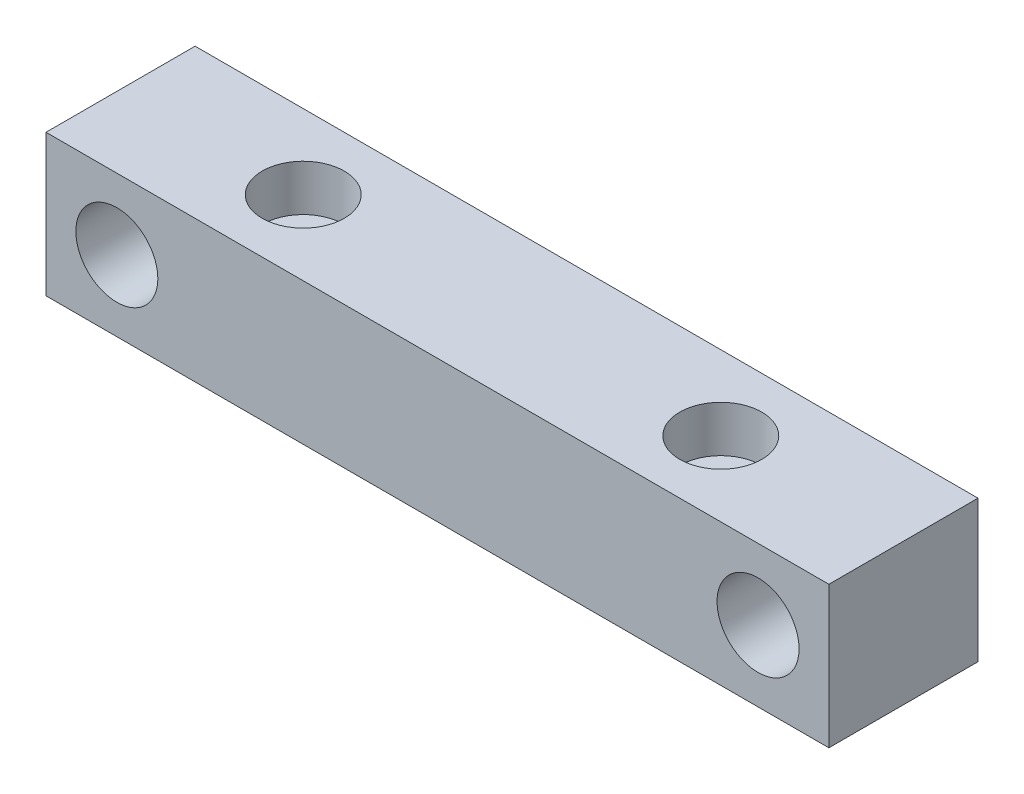
ISO-10303-21;
HEADER;
FILE_DESCRIPTION(('STEP AP214'),'2;1');
FILE_NAME('part.step','',(''),(''),'','','');
FILE_SCHEMA(('AUTOMOTIVE_DESIGN { 1 0 10303 214 1 1 1 1 }'));
ENDSEC;
DATA;
#1=APPLICATION_CONTEXT('core data for automotive mechanical design processes');
#2=APPLICATION_PROTOCOL_DEFINITION('international standard','automotive_design',2000,#1);
#3=PRODUCT_CONTEXT('',#1,'mechanical');
#4=PRODUCT('Part','Part','',(#3));
#5=PRODUCT_RELATED_PRODUCT_CATEGORY('part','',(#4));
#6=PRODUCT_DEFINITION_FORMATION('','',#4);
#7=PRODUCT_DEFINITION_CONTEXT('part definition',#1,'design');
#8=PRODUCT_DEFINITION('design','',#6,#7);
#9=PRODUCT_DEFINITION_SHAPE('','',#8);
#10=(LENGTH_UNIT() NAMED_UNIT(*) SI_UNIT(.MILLI.,.METRE.));
#11=(NAMED_UNIT(*) PLANE_ANGLE_UNIT() SI_UNIT($,.RADIAN.));
#12=(NAMED_UNIT(*) SI_UNIT($,.STERADIAN.) SOLID_ANGLE_UNIT());
#13=UNCERTAINTY_MEASURE_WITH_UNIT(LENGTH_MEASURE(1.E-05),#10,'distance_accuracy_value','');
#14=(GEOMETRIC_REPRESENTATION_CONTEXT(3) GLOBAL_UNCERTAINTY_ASSIGNED_CONTEXT((#13)) GLOBAL_UNIT_ASSIGNED_CONTEXT((#10,
#11,#12)) REPRESENTATION_CONTEXT('',''));
#15=CARTESIAN_POINT('',(0.,0.,0.));
#16=DIRECTION('',(0.,0.,1.));
#17=DIRECTION('',(1.,0.,0.));
#18=AXIS2_PLACEMENT_3D('',#15,#16,#17);
#19=CARTESIAN_POINT('',(-10.7499999999994,-11.4997460961056,5.));
#20=DIRECTION('',(0.,1.,0.));
#21=DIRECTION('',(0.,0.,1.));
#22=AXIS2_PLACEMENT_3D('',#19,#20,#21);
#23=CYLINDRICAL_SURFACE('',#22,1.375);
#24=CARTESIAN_POINT('',(-10.7499999999994,-11.4987460961056,5.));
#25=DIRECTION('',(0.,1.,0.));
#26=DIRECTION('',(0.,0.,1.));
#27=AXIS2_PLACEMENT_3D('',#24,#25,#26);
#28=CIRCLE('',#27,1.375);
#29=CARTESIAN_POINT('',(-10.7499999999994,-11.4987460961056,6.375));
#30=VERTEX_POINT('',#29);
#31=EDGE_CURVE('E126',#30,#30,#28,.F.);
#32=ORIENTED_EDGE('',*,*,#31,.T.);
#33=EDGE_LOOP('',(#32));
#34=FACE_BOUND('',#33,.T.);
#35=CARTESIAN_POINT('',(-10.7499999999994,-5.098746096105,5.));
#36=DIRECTION('',(0.,1.,0.));
#37=DIRECTION('',(0.,0.,1.));
#38=AXIS2_PLACEMENT_3D('',#35,#36,#37);
#39=CIRCLE('',#38,1.375);
#40=CARTESIAN_POINT('',(-10.7499999999994,-5.098746096105,6.375));
#41=VERTEX_POINT('',#40);
#42=EDGE_CURVE('E119',#41,#41,#39,.F.);
#43=ORIENTED_EDGE('',*,*,#42,.F.);
#44=EDGE_LOOP('',(#43));
#45=FACE_BOUND('',#44,.T.);
#46=ADVANCED_FACE('F34',(#34,#45),#23,.F.);
#47=CARTESIAN_POINT('',(0.,0.,10.));
#48=DIRECTION('',(0.,0.,1.));
#49=DIRECTION('',(1.,0.,0.));
#50=AXIS2_PLACEMENT_3D('',#47,#48,#49);
#51=PLANE('',#50);
#52=CARTESIAN_POINT('',(-3.24999999999941,-6.74874609610532,10.));
#53=DIRECTION('',(0.,0.,1.));
#54=DIRECTION('',(1.,0.,0.));
#55=AXIS2_PLACEMENT_3D('',#52,#53,#54);
#56=CIRCLE('',#55,2.75000000000001);
#57=CARTESIAN_POINT('',(-0.499999999999405,-6.74874609610532,10.));
#58=VERTEX_POINT('',#57);
#59=EDGE_CURVE('E141',#58,#58,#56,.T.);
#60=ORIENTED_EDGE('',*,*,#59,.F.);
#61=EDGE_LOOP('',(#60));
#62=FACE_BOUND('',#61,.T.);
#63=CARTESIAN_POINT('',(-46.2500000000005,-6.74874609610562,10.));
#64=DIRECTION('',(0.,0.,1.));
#65=DIRECTION('',(1.,0.,0.));
#66=AXIS2_PLACEMENT_3D('',#63,#64,#65);
#67=CIRCLE('',#66,2.75);
#68=CARTESIAN_POINT('',(-43.5000000000005,-6.74874609610562,10.));
#69=VERTEX_POINT('',#68);
#70=EDGE_CURVE('E117',#69,#69,#67,.T.);
#71=ORIENTED_EDGE('',*,*,#70,.F.);
#72=EDGE_LOOP('',(#71));
#73=FACE_BOUND('',#72,.T.);
#74=DIRECTION('',(0.,-1.,0.));
#75=VECTOR('',#74,1.);
#76=CARTESIAN_POINT('',(-51.0000000000009,-1.99874609610499,10.));
#77=LINE('',#76,#75);
#78=CARTESIAN_POINT('',(-51.0000000000009,-1.99874609610499,10.));
#79=VERTEX_POINT('',#78);
#80=CARTESIAN_POINT('',(-51.0000000000009,-11.4987460961056,10.));
#81=VERTEX_POINT('',#80);
#82=EDGE_CURVE('E88',#79,#81,#77,.T.);
#83=ORIENTED_EDGE('',*,*,#82,.T.);
#84=DIRECTION('',(1.,0.,0.));
#85=VECTOR('',#84,1.);
#86=CARTESIAN_POINT('',(-51.0000000000009,-11.4987460961056,10.));
#87=LINE('',#86,#85);
#88=CARTESIAN_POINT('',(1.50000000000021,-11.4987460961056,10.));
#89=VERTEX_POINT('',#88);
#90=EDGE_CURVE('E83',#81,#89,#87,.T.);
#91=ORIENTED_EDGE('',*,*,#90,.T.);
#92=DIRECTION('',(0.,1.,0.));
#93=VECTOR('',#92,1.);
#94=CARTESIAN_POINT('',(1.50000000000021,-1.99874609610499,10.));
#95=LINE('',#94,#93);
#96=CARTESIAN_POINT('',(1.50000000000021,-1.99874609610499,10.));
#97=VERTEX_POINT('',#96);
#98=EDGE_CURVE('E86',#89,#97,#95,.T.);
#99=ORIENTED_EDGE('',*,*,#98,.T.);
#100=DIRECTION('',(-1.,0.,0.));
#101=VECTOR('',#100,1.);
#102=CARTESIAN_POINT('',(-51.0000000000009,-1.99874609610499,10.));
#103=LINE('',#102,#101);
#104=EDGE_CURVE('E53',#97,#79,#103,.T.);
#105=ORIENTED_EDGE('',*,*,#104,.T.);
#106=EDGE_LOOP('',(#83,#91,#99,#105));
#107=FACE_BOUND('',#106,.T.);
#108=ADVANCED_FACE('F84',(#62,#73,#107),#51,.T.);
#109=CARTESIAN_POINT('',(0.,0.,0.));
#110=DIRECTION('',(0.,0.,1.));
#111=DIRECTION('',(1.,0.,0.));
#112=AXIS2_PLACEMENT_3D('',#109,#110,#111);
#113=PLANE('',#112);
#114=DIRECTION('',(0.,-1.,0.));
#115=VECTOR('',#114,1.);
#116=CARTESIAN_POINT('',(-51.0000000000009,-1.99874609610499,0.));
#117=LINE('',#116,#115);
#118=CARTESIAN_POINT('',(-51.0000000000009,-1.99874609610499,0.));
#119=VERTEX_POINT('',#118);
#120=CARTESIAN_POINT('',(-51.0000000000009,-11.4987460961056,0.));
#121=VERTEX_POINT('',#120);
#122=EDGE_CURVE('E101',#119,#121,#117,.T.);
#123=ORIENTED_EDGE('',*,*,#122,.F.);
#124=DIRECTION('',(-1.,0.,0.));
#125=VECTOR('',#124,1.);
#126=CARTESIAN_POINT('',(-51.0000000000009,-1.99874609610499,0.));
#127=LINE('',#126,#125);
#128=CARTESIAN_POINT('',(1.50000000000021,-1.99874609610499,0.));
#129=VERTEX_POINT('',#128);
#130=EDGE_CURVE('E76',#129,#119,#127,.T.);
#131=ORIENTED_EDGE('',*,*,#130,.F.);
#132=DIRECTION('',(0.,1.,0.));
#133=VECTOR('',#132,1.);
#134=CARTESIAN_POINT('',(1.50000000000021,-1.99874609610499,0.));
#135=LINE('',#134,#133);
#136=CARTESIAN_POINT('',(1.50000000000021,-11.4987460961056,0.));
#137=VERTEX_POINT('',#136);
#138=EDGE_CURVE('E70',#137,#129,#135,.T.);
#139=ORIENTED_EDGE('',*,*,#138,.F.);
#140=DIRECTION('',(1.,0.,0.));
#141=VECTOR('',#140,1.);
#142=CARTESIAN_POINT('',(-51.0000000000009,-11.4987460961056,0.));
#143=LINE('',#142,#141);
#144=EDGE_CURVE('E92',#121,#137,#143,.T.);
#145=ORIENTED_EDGE('',*,*,#144,.F.);
#146=EDGE_LOOP('',(#123,#131,#139,#145));
#147=FACE_BOUND('',#146,.T.);
#148=CARTESIAN_POINT('',(-46.2500000000005,-6.74874609610562,0.));
#149=DIRECTION('',(0.,0.,1.));
#150=DIRECTION('',(1.,0.,0.));
#151=AXIS2_PLACEMENT_3D('',#148,#149,#150);
#152=CIRCLE('',#151,1.375);
#153=CARTESIAN_POINT('',(-44.8750000000005,-6.74874609610562,0.));
#154=VERTEX_POINT('',#153);
#155=EDGE_CURVE('E104',#154,#154,#152,.T.);
#156=ORIENTED_EDGE('',*,*,#155,.T.);
#157=EDGE_LOOP('',(#156));
#158=FACE_BOUND('',#157,.T.);
#159=CARTESIAN_POINT('',(-3.24999999999941,-6.74874609610532,0.));
#160=DIRECTION('',(0.,0.,1.));
#161=DIRECTION('',(1.,0.,0.));
#162=AXIS2_PLACEMENT_3D('',#159,#160,#161);
#163=CIRCLE('',#162,1.375);
#164=CARTESIAN_POINT('',(-1.87499999999941,-6.74874609610532,0.));
#165=VERTEX_POINT('',#164);
#166=EDGE_CURVE('E113',#165,#165,#163,.T.);
#167=ORIENTED_EDGE('',*,*,#166,.T.);
#168=EDGE_LOOP('',(#167));
#169=FACE_BOUND('',#168,.T.);
#170=ADVANCED_FACE('F155',(#147,#158,#169),#113,.F.);
#171=CARTESIAN_POINT('',(-51.0000000000009,-1.99874609610499,10.));
#172=DIRECTION('',(1.,0.,0.));
#173=DIRECTION('',(0.,0.,-1.));
#174=AXIS2_PLACEMENT_3D('',#171,#172,#173);
#175=PLANE('',#174);
#176=ORIENTED_EDGE('',*,*,#122,.T.);
#177=DIRECTION('',(0.,0.,-1.));
#178=VECTOR('',#177,1.);
#179=CARTESIAN_POINT('',(-51.0000000000009,-11.4987460961056,10.));
#180=LINE('',#179,#178);
#181=EDGE_CURVE('E12',#81,#121,#180,.T.);
#182=ORIENTED_EDGE('',*,*,#181,.F.);
#183=ORIENTED_EDGE('',*,*,#82,.F.);
#184=DIRECTION('',(0.,0.,-1.));
#185=VECTOR('',#184,1.);
#186=CARTESIAN_POINT('',(-51.0000000000009,-1.99874609610499,10.));
#187=LINE('',#186,#185);
#188=EDGE_CURVE('E97',#79,#119,#187,.T.);
#189=ORIENTED_EDGE('',*,*,#188,.T.);
#190=EDGE_LOOP('',(#176,#182,#183,#189));
#191=FACE_BOUND('',#190,.T.);
#192=ADVANCED_FACE('F36',(#191),#175,.F.);
#193=CARTESIAN_POINT('',(-51.0000000000009,-11.4987460961056,10.));
#194=DIRECTION('',(0.,1.,0.));
#195=DIRECTION('',(0.,0.,1.));
#196=AXIS2_PLACEMENT_3D('',#193,#194,#195);
#197=PLANE('',#196);
#198=CARTESIAN_POINT('',(-38.7500000000013,-11.4987460961056,5.));
#199=DIRECTION('',(0.,1.,0.));
#200=DIRECTION('',(0.,0.,1.));
#201=AXIS2_PLACEMENT_3D('',#198,#199,#200);
#202=CIRCLE('',#201,1.375);
#203=CARTESIAN_POINT('',(-38.7500000000013,-11.4987460961056,6.375));
#204=VERTEX_POINT('',#203);
#205=EDGE_CURVE('E121',#204,#204,#202,.F.);
#206=ORIENTED_EDGE('',*,*,#205,.F.);
#207=EDGE_LOOP('',(#206));
#208=FACE_BOUND('',#207,.T.);
#209=ORIENTED_EDGE('',*,*,#31,.F.);
#210=EDGE_LOOP('',(#209));
#211=FACE_BOUND('',#210,.T.);
#212=ORIENTED_EDGE('',*,*,#144,.T.);
#213=DIRECTION('',(0.,0.,-1.));
#214=VECTOR('',#213,1.);
#215=CARTESIAN_POINT('',(1.50000000000021,-11.4987460961056,10.));
#216=LINE('',#215,#214);
#217=EDGE_CURVE('E44',#89,#137,#216,.T.);
#218=ORIENTED_EDGE('',*,*,#217,.F.);
#219=ORIENTED_EDGE('',*,*,#90,.F.);
#220=ORIENTED_EDGE('',*,*,#181,.T.);
#221=EDGE_LOOP('',(#212,#218,#219,#220));
#222=FACE_BOUND('',#221,.T.);
#223=ADVANCED_FACE('F91',(#208,#211,#222),#197,.F.);
#224=CARTESIAN_POINT('',(1.50000000000021,-1.99874609610499,10.));
#225=DIRECTION('',(-1.,0.,0.));
#226=DIRECTION('',(0.,0.,1.));
#227=AXIS2_PLACEMENT_3D('',#224,#225,#226);
#228=PLANE('',#227);
#229=ORIENTED_EDGE('',*,*,#138,.T.);
#230=DIRECTION('',(0.,0.,-1.));
#231=VECTOR('',#230,1.);
#232=CARTESIAN_POINT('',(1.50000000000021,-1.99874609610499,10.));
#233=LINE('',#232,#231);
#234=EDGE_CURVE('E93',#97,#129,#233,.T.);
#235=ORIENTED_EDGE('',*,*,#234,.F.);
#236=ORIENTED_EDGE('',*,*,#98,.F.);
#237=ORIENTED_EDGE('',*,*,#217,.T.);
#238=EDGE_LOOP('',(#229,#235,#236,#237));
#239=FACE_BOUND('',#238,.T.);
#240=ADVANCED_FACE('F95',(#239),#228,.F.);
#241=CARTESIAN_POINT('',(-51.0000000000009,-1.99874609610499,10.));
#242=DIRECTION('',(0.,-1.,0.));
#243=DIRECTION('',(0.,0.,-1.));
#244=AXIS2_PLACEMENT_3D('',#241,#242,#243);
#245=PLANE('',#244);
#246=CARTESIAN_POINT('',(-38.7500000000013,-1.99874609610499,5.));
#247=DIRECTION('',(0.,1.,0.));
#248=DIRECTION('',(0.,0.,-1.));
#249=AXIS2_PLACEMENT_3D('',#246,#247,#248);
#250=CIRCLE('',#249,2.75);
#251=CARTESIAN_POINT('',(-38.7500000000013,-1.99874609610499,7.75));
#252=VERTEX_POINT('',#251);
#253=EDGE_CURVE('E136',#252,#252,#250,.T.);
#254=ORIENTED_EDGE('',*,*,#253,.F.);
#255=EDGE_LOOP('',(#254));
#256=FACE_BOUND('',#255,.T.);
#257=CARTESIAN_POINT('',(-10.7499999999994,-1.99874609610499,5.));
#258=DIRECTION('',(0.,1.,0.));
#259=DIRECTION('',(0.,0.,1.));
#260=AXIS2_PLACEMENT_3D('',#257,#258,#259);
#261=CIRCLE('',#260,2.75);
#262=CARTESIAN_POINT('',(-10.7499999999994,-1.99874609610499,7.75));
#263=VERTEX_POINT('',#262);
#264=EDGE_CURVE('E129',#263,#263,#261,.T.);
#265=ORIENTED_EDGE('',*,*,#264,.F.);
#266=EDGE_LOOP('',(#265));
#267=FACE_BOUND('',#266,.T.);
#268=ORIENTED_EDGE('',*,*,#130,.T.);
#269=ORIENTED_EDGE('',*,*,#188,.F.);
#270=ORIENTED_EDGE('',*,*,#104,.F.);
#271=ORIENTED_EDGE('',*,*,#234,.T.);
#272=EDGE_LOOP('',(#268,#269,#270,#271));
#273=FACE_BOUND('',#272,.T.);
#274=ADVANCED_FACE('F161',(#256,#267,#273),#245,.F.);
#275=CARTESIAN_POINT('',(-46.2500000000005,-6.74874609610562,10.));
#276=DIRECTION('',(0.,0.,-1.));
#277=DIRECTION('',(-1.,0.,0.));
#278=AXIS2_PLACEMENT_3D('',#275,#276,#277);
#279=CYLINDRICAL_SURFACE('',#278,1.375);
#280=CARTESIAN_POINT('',(-46.2500000000005,-6.74874609610562,3.));
#281=DIRECTION('',(0.,0.,-1.));
#282=DIRECTION('',(-1.,0.,0.));
#283=AXIS2_PLACEMENT_3D('',#280,#281,#282);
#284=CIRCLE('',#283,1.375);
#285=CARTESIAN_POINT('',(-47.6250000000005,-6.74874609610562,3.));
#286=VERTEX_POINT('',#285);
#287=EDGE_CURVE('E110',#286,#286,#284,.T.);
#288=ORIENTED_EDGE('',*,*,#287,.F.);
#289=EDGE_LOOP('',(#288));
#290=FACE_BOUND('',#289,.T.);
#291=ORIENTED_EDGE('',*,*,#155,.F.);
#292=EDGE_LOOP('',(#291));
#293=FACE_BOUND('',#292,.T.);
#294=ADVANCED_FACE('F158',(#290,#293),#279,.F.);
#295=CARTESIAN_POINT('',(-3.24999999999941,-6.74874609610532,10.));
#296=DIRECTION('',(0.,0.,-1.));
#297=DIRECTION('',(-1.,0.,0.));
#298=AXIS2_PLACEMENT_3D('',#295,#296,#297);
#299=CYLINDRICAL_SURFACE('',#298,1.375);
#300=CARTESIAN_POINT('',(-3.24999999999941,-6.74874609610532,3.));
#301=DIRECTION('',(0.,0.,-1.));
#302=DIRECTION('',(-1.,0.,0.));
#303=AXIS2_PLACEMENT_3D('',#300,#301,#302);
#304=CIRCLE('',#303,1.375);
#305=CARTESIAN_POINT('',(-4.62499999999942,-6.74874609610532,3.));
#306=VERTEX_POINT('',#305);
#307=EDGE_CURVE('E115',#306,#306,#304,.T.);
#308=ORIENTED_EDGE('',*,*,#307,.F.);
#309=EDGE_LOOP('',(#308));
#310=FACE_BOUND('',#309,.T.);
#311=ORIENTED_EDGE('',*,*,#166,.F.);
#312=EDGE_LOOP('',(#311));
#313=FACE_BOUND('',#312,.T.);
#314=ADVANCED_FACE('F160',(#310,#313),#299,.F.);
#315=CARTESIAN_POINT('',(10.7499999999997,-17.1999999999999,3.));
#316=DIRECTION('',(0.,0.,-1.));
#317=DIRECTION('',(0.,1.,0.));
#318=AXIS2_PLACEMENT_3D('',#315,#316,#317);
#319=PLANE('',#318);
#320=ORIENTED_EDGE('',*,*,#287,.T.);
#321=EDGE_LOOP('',(#320));
#322=FACE_BOUND('',#321,.T.);
#323=CARTESIAN_POINT('',(-46.2500000000005,-6.74874609610562,3.));
#324=DIRECTION('',(0.,0.,-1.));
#325=DIRECTION('',(-1.,0.,0.));
#326=AXIS2_PLACEMENT_3D('',#323,#324,#325);
#327=CIRCLE('',#326,2.75);
#328=CARTESIAN_POINT('',(-49.0000000000005,-6.74874609610562,3.));
#329=VERTEX_POINT('',#328);
#330=EDGE_CURVE('E114',#329,#329,#327,.F.);
#331=ORIENTED_EDGE('',*,*,#330,.T.);
#332=EDGE_LOOP('',(#331));
#333=FACE_BOUND('',#332,.T.);
#334=ADVANCED_FACE('F168',(#322,#333),#319,.F.);
#335=CARTESIAN_POINT('',(-46.2500000000005,-6.74874609610562,-7.77817459305204));
#336=DIRECTION('',(0.,0.,1.));
#337=DIRECTION('',(1.,0.,0.));
#338=AXIS2_PLACEMENT_3D('',#335,#336,#337);
#339=CYLINDRICAL_SURFACE('',#338,2.75);
#340=ORIENTED_EDGE('',*,*,#70,.T.);
#341=EDGE_LOOP('',(#340));
#342=FACE_BOUND('',#341,.T.);
#343=ORIENTED_EDGE('',*,*,#330,.F.);
#344=EDGE_LOOP('',(#343));
#345=FACE_BOUND('',#344,.T.);
#346=ADVANCED_FACE('F194',(#342,#345),#339,.F.);
#347=CARTESIAN_POINT('',(10.7499999999997,-17.1999999999999,3.));
#348=DIRECTION('',(0.,0.,-1.));
#349=DIRECTION('',(0.,1.,0.));
#350=AXIS2_PLACEMENT_3D('',#347,#348,#349);
#351=PLANE('',#350);
#352=ORIENTED_EDGE('',*,*,#307,.T.);
#353=EDGE_LOOP('',(#352));
#354=FACE_BOUND('',#353,.T.);
#355=CARTESIAN_POINT('',(-3.24999999999941,-6.74874609610532,3.));
#356=DIRECTION('',(0.,0.,-1.));
#357=DIRECTION('',(-1.,0.,0.));
#358=AXIS2_PLACEMENT_3D('',#355,#356,#357);
#359=CIRCLE('',#358,2.75000000000001);
#360=CARTESIAN_POINT('',(-5.99999999999942,-6.74874609610532,3.));
#361=VERTEX_POINT('',#360);
#362=EDGE_CURVE('E118',#361,#361,#359,.F.);
#363=ORIENTED_EDGE('',*,*,#362,.T.);
#364=EDGE_LOOP('',(#363));
#365=FACE_BOUND('',#364,.T.);
#366=ADVANCED_FACE('F190',(#354,#365),#351,.F.);
#367=CARTESIAN_POINT('',(-3.24999999999941,-6.74874609610532,-7.77817459305204));
#368=DIRECTION('',(0.,0.,1.));
#369=DIRECTION('',(1.,0.,0.));
#370=AXIS2_PLACEMENT_3D('',#367,#368,#369);
#371=CYLINDRICAL_SURFACE('',#370,2.75000000000001);
#372=ORIENTED_EDGE('',*,*,#59,.T.);
#373=EDGE_LOOP('',(#372));
#374=FACE_BOUND('',#373,.T.);
#375=ORIENTED_EDGE('',*,*,#362,.F.);
#376=EDGE_LOOP('',(#375));
#377=FACE_BOUND('',#376,.T.);
#378=ADVANCED_FACE('F187',(#374,#377),#371,.F.);
#379=CARTESIAN_POINT('',(-38.7500000000013,-11.4997460961056,5.));
#380=DIRECTION('',(0.,1.,0.));
#381=DIRECTION('',(0.,0.,1.));
#382=AXIS2_PLACEMENT_3D('',#379,#380,#381);
#383=CYLINDRICAL_SURFACE('',#382,1.375);
#384=CARTESIAN_POINT('',(-38.7500000000013,-5.098746096105,5.));
#385=DIRECTION('',(0.,-1.,0.));
#386=DIRECTION('',(0.,0.,-1.));
#387=AXIS2_PLACEMENT_3D('',#384,#385,#386);
#388=CIRCLE('',#387,1.375);
#389=CARTESIAN_POINT('',(-38.7500000000013,-5.098746096105,3.625));
#390=VERTEX_POINT('',#389);
#391=EDGE_CURVE('E38',#390,#390,#388,.F.);
#392=ORIENTED_EDGE('',*,*,#391,.T.);
#393=EDGE_LOOP('',(#392));
#394=FACE_BOUND('',#393,.T.);
#395=ORIENTED_EDGE('',*,*,#205,.T.);
#396=EDGE_LOOP('',(#395));
#397=FACE_BOUND('',#396,.T.);
#398=ADVANCED_FACE('F185',(#394,#397),#383,.F.);
#399=CARTESIAN_POINT('',(-10.7499999999994,-5.098746096105,5.));
#400=DIRECTION('',(0.,1.,0.));
#401=DIRECTION('',(0.,0.,1.));
#402=AXIS2_PLACEMENT_3D('',#399,#400,#401);
#403=PLANE('',#402);
#404=CARTESIAN_POINT('',(-10.7499999999994,-5.098746096105,5.));
#405=DIRECTION('',(0.,1.,0.));
#406=DIRECTION('',(0.,0.,1.));
#407=AXIS2_PLACEMENT_3D('',#404,#405,#406);
#408=CIRCLE('',#407,2.75);
#409=CARTESIAN_POINT('',(-10.7499999999994,-5.098746096105,7.75));
#410=VERTEX_POINT('',#409);
#411=EDGE_CURVE('E122',#410,#410,#408,.T.);
#412=ORIENTED_EDGE('',*,*,#411,.T.);
#413=EDGE_LOOP('',(#412));
#414=FACE_BOUND('',#413,.T.);
#415=ORIENTED_EDGE('',*,*,#42,.T.);
#416=EDGE_LOOP('',(#415));
#417=FACE_BOUND('',#416,.T.);
#418=ADVANCED_FACE('F227',(#414,#417),#403,.T.);
#419=CARTESIAN_POINT('',(-10.7499999999994,-5.098746096105,5.));
#420=DIRECTION('',(0.,1.,0.));
#421=DIRECTION('',(0.,0.,1.));
#422=AXIS2_PLACEMENT_3D('',#419,#420,#421);
#423=CYLINDRICAL_SURFACE('',#422,2.75);
#424=CARTESIAN_POINT('',(-10.7499999999994,-5.098746096105,7.75));
#425=CARTESIAN_POINT('',(-10.7499999999994,-5.06645442943833,7.75));
#426=CARTESIAN_POINT('',(-10.7499999999994,-5.03416276277166,7.75));
#427=CARTESIAN_POINT('',(-10.7499999999994,-4.96957942943833,7.75));
#428=CARTESIAN_POINT('',(-10.7499999999994,-4.93728776277166,7.75));
#429=CARTESIAN_POINT('',(-10.7499999999994,-4.87270442943833,7.75));
#430=CARTESIAN_POINT('',(-10.7499999999994,-4.84041276277166,7.75));
#431=CARTESIAN_POINT('',(-10.7499999999994,-4.77582942943833,7.75));
#432=CARTESIAN_POINT('',(-10.7499999999994,-4.74353776277166,7.75));
#433=CARTESIAN_POINT('',(-10.7499999999994,-4.67895442943833,7.75));
#434=CARTESIAN_POINT('',(-10.7499999999994,-4.64666276277166,7.75));
#435=CARTESIAN_POINT('',(-10.7499999999994,-4.58207942943833,7.75));
#436=CARTESIAN_POINT('',(-10.7499999999994,-4.54978776277166,7.75));
#437=CARTESIAN_POINT('',(-10.7499999999994,-4.48520442943833,7.75));
#438=CARTESIAN_POINT('',(-10.7499999999994,-4.45291276277166,7.75));
#439=CARTESIAN_POINT('',(-10.7499999999994,-4.38832942943833,7.75));
#440=CARTESIAN_POINT('',(-10.7499999999994,-4.35603776277166,7.75));
#441=CARTESIAN_POINT('',(-10.7499999999994,-4.29145442943833,7.75));
#442=CARTESIAN_POINT('',(-10.7499999999994,-4.25916276277166,7.75));
#443=CARTESIAN_POINT('',(-10.7499999999994,-4.19457942943833,7.75));
#444=CARTESIAN_POINT('',(-10.7499999999994,-4.16228776277166,7.75));
#445=CARTESIAN_POINT('',(-10.7499999999994,-4.09770442943833,7.75));
#446=CARTESIAN_POINT('',(-10.7499999999994,-4.06541276277166,7.75));
#447=CARTESIAN_POINT('',(-10.7499999999994,-4.00082942943833,7.75));
#448=CARTESIAN_POINT('',(-10.7499999999994,-3.96853776277166,7.75));
#449=CARTESIAN_POINT('',(-10.7499999999994,-3.90395442943833,7.75));
#450=CARTESIAN_POINT('',(-10.7499999999994,-3.87166276277166,7.75));
#451=CARTESIAN_POINT('',(-10.7499999999994,-3.80707942943833,7.75));
#452=CARTESIAN_POINT('',(-10.7499999999994,-3.77478776277166,7.75));
#453=CARTESIAN_POINT('',(-10.7499999999994,-3.71020442943833,7.75));
#454=CARTESIAN_POINT('',(-10.7499999999994,-3.67791276277166,7.75));
#455=CARTESIAN_POINT('',(-10.7499999999994,-3.61332942943833,7.75));
#456=CARTESIAN_POINT('',(-10.7499999999994,-3.58103776277166,7.75));
#457=CARTESIAN_POINT('',(-10.7499999999994,-3.51645442943833,7.75));
#458=CARTESIAN_POINT('',(-10.7499999999994,-3.48416276277166,7.75));
#459=CARTESIAN_POINT('',(-10.7499999999994,-3.41957942943833,7.75));
#460=CARTESIAN_POINT('',(-10.7499999999994,-3.38728776277166,7.75));
#461=CARTESIAN_POINT('',(-10.7499999999994,-3.32270442943833,7.75));
#462=CARTESIAN_POINT('',(-10.7499999999994,-3.29041276277166,7.75));
#463=CARTESIAN_POINT('',(-10.7499999999994,-3.22582942943833,7.75));
#464=CARTESIAN_POINT('',(-10.7499999999994,-3.19353776277166,7.75));
#465=CARTESIAN_POINT('',(-10.7499999999994,-3.12895442943833,7.75));
#466=CARTESIAN_POINT('',(-10.7499999999994,-3.09666276277166,7.75));
#467=CARTESIAN_POINT('',(-10.7499999999994,-3.03207942943833,7.75));
#468=CARTESIAN_POINT('',(-10.7499999999994,-2.99978776277166,7.75));
#469=CARTESIAN_POINT('',(-10.7499999999994,-2.93520442943833,7.75));
#470=CARTESIAN_POINT('',(-10.7499999999994,-2.90291276277166,7.75));
#471=CARTESIAN_POINT('',(-10.7499999999994,-2.83832942943833,7.75));
#472=CARTESIAN_POINT('',(-10.7499999999994,-2.80603776277166,7.75));
#473=CARTESIAN_POINT('',(-10.7499999999994,-2.74145442943833,7.75));
#474=CARTESIAN_POINT('',(-10.7499999999994,-2.70916276277166,7.75));
#475=CARTESIAN_POINT('',(-10.7499999999994,-2.64457942943833,7.75));
#476=CARTESIAN_POINT('',(-10.7499999999994,-2.61228776277166,7.75));
#477=CARTESIAN_POINT('',(-10.7499999999994,-2.54770442943833,7.75));
#478=CARTESIAN_POINT('',(-10.7499999999994,-2.51541276277166,7.75));
#479=CARTESIAN_POINT('',(-10.7499999999994,-2.45082942943833,7.75));
#480=CARTESIAN_POINT('',(-10.7499999999994,-2.41853776277166,7.75));
#481=CARTESIAN_POINT('',(-10.7499999999994,-2.35395442943833,7.75));
#482=CARTESIAN_POINT('',(-10.7499999999994,-2.32166276277166,7.75));
#483=CARTESIAN_POINT('',(-10.7499999999994,-2.25707942943833,7.75));
#484=CARTESIAN_POINT('',(-10.7499999999994,-2.22478776277166,7.75));
#485=CARTESIAN_POINT('',(-10.7499999999994,-2.16020442943833,7.75));
#486=CARTESIAN_POINT('',(-10.7499999999994,-2.12791276277166,7.75));
#487=CARTESIAN_POINT('',(-10.7499999999994,-2.06332942943833,7.75));
#488=CARTESIAN_POINT('',(-10.7499999999994,-2.03103776277166,7.75));
#489=CARTESIAN_POINT('',(-10.7499999999994,-1.99874609610499,7.75));
#490=B_SPLINE_CURVE_WITH_KNOTS('',3,(#424,#425,#426,#427,#428,#429,#430,#431,#432,#433,#434,
#435,#436,#437,#438,#439,#440,#441,#442,#443,#444,#445,#446,#447,#448,#449,#450,#451,#452,#453,
#454,#455,#456,#457,#458,#459,#460,#461,#462,#463,#464,#465,#466,#467,#468,#469,#470,#471,#472,
#473,#474,#475,#476,#477,#478,#479,#480,#481,#482,#483,#484,#485,#486,#487,#488,#489),
.UNSPECIFIED.,.F.,.F.,(4,2,2,2,2,2,2,2,2,2,2,2,2,2,2,2,2,2,2,2,2,2,2,2,2,2,2,2,2,2,2,2,4),(0.,
0.0968749999999997,0.193749999999999,0.290624999999999,0.3875,0.484375,0.581249999999999,
0.678125,0.775,0.871874999999999,0.96875,1.065625,1.1625,1.259375,1.35625,1.453125,1.55,
1.646875,1.74375,1.840625,1.9375,2.034375,2.13125,2.228125,2.325,2.421875,2.51875,2.615625,
2.7125,2.809375,2.90625,3.003125,3.1),.UNSPECIFIED.);
#491=EDGE_CURVE('BSEAM235',#410,#263,#490,.T.);
#492=ORIENTED_EDGE('',*,*,#411,.F.);
#493=ORIENTED_EDGE('',*,*,#264,.T.);
#494=ORIENTED_EDGE('',*,*,#491,.T.);
#495=ORIENTED_EDGE('',*,*,#491,.F.);
#496=EDGE_LOOP('',(#492,#494,#493,#495));
#497=FACE_BOUND('',#496,.T.);
#498=ADVANCED_FACE('F235',(#497),#423,.F.);
#499=CARTESIAN_POINT('',(-38.7500000000013,-5.098746096105,5.));
#500=DIRECTION('',(0.,-1.,0.));
#501=DIRECTION('',(0.,0.,-1.));
#502=AXIS2_PLACEMENT_3D('',#499,#500,#501);
#503=PLANE('',#502);
#504=CARTESIAN_POINT('',(-38.7500000000013,-5.098746096105,5.));
#505=DIRECTION('',(0.,1.,0.));
#506=DIRECTION('',(0.,0.,-1.));
#507=AXIS2_PLACEMENT_3D('',#504,#505,#506);
#508=CIRCLE('',#507,2.75);
#509=CARTESIAN_POINT('',(-38.7500000000013,-5.098746096105,7.75));
#510=VERTEX_POINT('',#509);
#511=EDGE_CURVE('E341',#510,#510,#508,.T.);
#512=ORIENTED_EDGE('',*,*,#511,.T.);
#513=EDGE_LOOP('',(#512));
#514=FACE_BOUND('',#513,.T.);
#515=ORIENTED_EDGE('',*,*,#391,.F.);
#516=EDGE_LOOP('',(#515));
#517=FACE_BOUND('',#516,.T.);
#518=ADVANCED_FACE('F242',(#514,#517),#503,.F.);
#519=CARTESIAN_POINT('',(-38.7500000000013,-5.098746096105,5.));
#520=DIRECTION('',(0.,1.,0.));
#521=DIRECTION('',(0.,0.,1.));
#522=AXIS2_PLACEMENT_3D('',#519,#520,#521);
#523=CYLINDRICAL_SURFACE('',#522,2.75);
#524=CARTESIAN_POINT('',(-38.7500000000013,-5.098746096105,7.75));
#525=CARTESIAN_POINT('',(-38.7500000000013,-5.06645442943833,7.75));
#526=CARTESIAN_POINT('',(-38.7500000000013,-5.03416276277166,7.75));
#527=CARTESIAN_POINT('',(-38.7500000000013,-4.96957942943833,7.75));
#528=CARTESIAN_POINT('',(-38.7500000000013,-4.93728776277166,7.75));
#529=CARTESIAN_POINT('',(-38.7500000000013,-4.87270442943833,7.75));
#530=CARTESIAN_POINT('',(-38.7500000000013,-4.84041276277166,7.75));
#531=CARTESIAN_POINT('',(-38.7500000000013,-4.77582942943833,7.75));
#532=CARTESIAN_POINT('',(-38.7500000000013,-4.74353776277166,7.75));
#533=CARTESIAN_POINT('',(-38.7500000000013,-4.67895442943833,7.75));
#534=CARTESIAN_POINT('',(-38.7500000000013,-4.64666276277166,7.75));
#535=CARTESIAN_POINT('',(-38.7500000000013,-4.58207942943833,7.75));
#536=CARTESIAN_POINT('',(-38.7500000000013,-4.54978776277166,7.75));
#537=CARTESIAN_POINT('',(-38.7500000000013,-4.48520442943833,7.75));
#538=CARTESIAN_POINT('',(-38.7500000000013,-4.45291276277166,7.75));
#539=CARTESIAN_POINT('',(-38.7500000000013,-4.38832942943833,7.75));
#540=CARTESIAN_POINT('',(-38.7500000000013,-4.35603776277166,7.75));
#541=CARTESIAN_POINT('',(-38.7500000000013,-4.29145442943833,7.75));
#542=CARTESIAN_POINT('',(-38.7500000000013,-4.25916276277166,7.75));
#543=CARTESIAN_POINT('',(-38.7500000000013,-4.19457942943833,7.75));
#544=CARTESIAN_POINT('',(-38.7500000000013,-4.16228776277166,7.75));
#545=CARTESIAN_POINT('',(-38.7500000000013,-4.09770442943833,7.75));
#546=CARTESIAN_POINT('',(-38.7500000000013,-4.06541276277166,7.75));
#547=CARTESIAN_POINT('',(-38.7500000000013,-4.00082942943833,7.75));
#548=CARTESIAN_POINT('',(-38.7500000000013,-3.96853776277166,7.75));
#549=CARTESIAN_POINT('',(-38.7500000000013,-3.90395442943833,7.75));
#550=CARTESIAN_POINT('',(-38.7500000000013,-3.87166276277166,7.75));
#551=CARTESIAN_POINT('',(-38.7500000000013,-3.80707942943833,7.75));
#552=CARTESIAN_POINT('',(-38.7500000000013,-3.77478776277166,7.75));
#553=CARTESIAN_POINT('',(-38.7500000000013,-3.71020442943833,7.75));
#554=CARTESIAN_POINT('',(-38.7500000000013,-3.67791276277166,7.75));
#555=CARTESIAN_POINT('',(-38.7500000000013,-3.61332942943833,7.75));
#556=CARTESIAN_POINT('',(-38.7500000000013,-3.58103776277166,7.75));
#557=CARTESIAN_POINT('',(-38.7500000000013,-3.51645442943833,7.75));
#558=CARTESIAN_POINT('',(-38.7500000000013,-3.48416276277166,7.75));
#559=CARTESIAN_POINT('',(-38.7500000000013,-3.41957942943833,7.75));
#560=CARTESIAN_POINT('',(-38.7500000000013,-3.38728776277166,7.75));
#561=CARTESIAN_POINT('',(-38.7500000000013,-3.32270442943833,7.75));
#562=CARTESIAN_POINT('',(-38.7500000000013,-3.29041276277166,7.75));
#563=CARTESIAN_POINT('',(-38.7500000000013,-3.22582942943833,7.75));
#564=CARTESIAN_POINT('',(-38.7500000000013,-3.19353776277166,7.75));
#565=CARTESIAN_POINT('',(-38.7500000000013,-3.12895442943833,7.75));
#566=CARTESIAN_POINT('',(-38.7500000000013,-3.09666276277166,7.75));
#567=CARTESIAN_POINT('',(-38.7500000000013,-3.03207942943833,7.75));
#568=CARTESIAN_POINT('',(-38.7500000000013,-2.99978776277166,7.75));
#569=CARTESIAN_POINT('',(-38.7500000000013,-2.93520442943833,7.75));
#570=CARTESIAN_POINT('',(-38.7500000000013,-2.90291276277166,7.75));
#571=CARTESIAN_POINT('',(-38.7500000000013,-2.83832942943833,7.75));
#572=CARTESIAN_POINT('',(-38.7500000000013,-2.80603776277166,7.75));
#573=CARTESIAN_POINT('',(-38.7500000000013,-2.74145442943833,7.75));
#574=CARTESIAN_POINT('',(-38.7500000000013,-2.70916276277166,7.75));
#575=CARTESIAN_POINT('',(-38.7500000000013,-2.64457942943833,7.75));
#576=CARTESIAN_POINT('',(-38.7500000000013,-2.61228776277166,7.75));
#577=CARTESIAN_POINT('',(-38.7500000000013,-2.54770442943833,7.75));
#578=CARTESIAN_POINT('',(-38.7500000000013,-2.51541276277166,7.75));
#579=CARTESIAN_POINT('',(-38.7500000000013,-2.45082942943833,7.75));
#580=CARTESIAN_POINT('',(-38.7500000000013,-2.41853776277166,7.75));
#581=CARTESIAN_POINT('',(-38.7500000000013,-2.35395442943833,7.75));
#582=CARTESIAN_POINT('',(-38.7500000000013,-2.32166276277166,7.75));
#583=CARTESIAN_POINT('',(-38.7500000000013,-2.25707942943833,7.75));
#584=CARTESIAN_POINT('',(-38.7500000000013,-2.22478776277166,7.75));
#585=CARTESIAN_POINT('',(-38.7500000000013,-2.16020442943833,7.75));
#586=CARTESIAN_POINT('',(-38.7500000000013,-2.12791276277166,7.75));
#587=CARTESIAN_POINT('',(-38.7500000000013,-2.06332942943833,7.75));
#588=CARTESIAN_POINT('',(-38.7500000000013,-2.03103776277166,7.75));
#589=CARTESIAN_POINT('',(-38.7500000000013,-1.99874609610499,7.75));
#590=B_SPLINE_CURVE_WITH_KNOTS('',3,(#524,#525,#526,#527,#528,#529,#530,#531,#532,#533,#534,
#535,#536,#537,#538,#539,#540,#541,#542,#543,#544,#545,#546,#547,#548,#549,#550,#551,#552,#553,
#554,#555,#556,#557,#558,#559,#560,#561,#562,#563,#564,#565,#566,#567,#568,#569,#570,#571,#572,
#573,#574,#575,#576,#577,#578,#579,#580,#581,#582,#583,#584,#585,#586,#587,#588,#589),
.UNSPECIFIED.,.F.,.F.,(4,2,2,2,2,2,2,2,2,2,2,2,2,2,2,2,2,2,2,2,2,2,2,2,2,2,2,2,2,2,2,2,4),(0.,
0.0968749999999997,0.193749999999999,0.290624999999999,0.3875,0.484375,0.581249999999999,
0.678125,0.775,0.871874999999999,0.96875,1.065625,1.1625,1.259375,1.35625,1.453125,1.55,
1.646875,1.74375,1.840625,1.9375,2.034375,2.13125,2.228125,2.325,2.421875,2.51875,2.615625,
2.7125,2.809375,2.90625,3.003125,3.1),.UNSPECIFIED.);
#591=EDGE_CURVE('BSEAM249',#510,#252,#590,.T.);
#592=ORIENTED_EDGE('',*,*,#511,.F.);
#593=ORIENTED_EDGE('',*,*,#253,.T.);
#594=ORIENTED_EDGE('',*,*,#591,.T.);
#595=ORIENTED_EDGE('',*,*,#591,.F.);
#596=EDGE_LOOP('',(#592,#594,#593,#595));
#597=FACE_BOUND('',#596,.T.);
#598=ADVANCED_FACE('F249',(#597),#523,.F.);
#599=CLOSED_SHELL('',(#46,#108,#170,#192,#223,#240,#274,#294,#314,#334,#346,#366,#378,#398,#418,
#498,#518,#598));
#600=MANIFOLD_SOLID_BREP('B2',#599);
#601=ADVANCED_BREP_SHAPE_REPRESENTATION('',(#18,#600),#14);
#602=SHAPE_DEFINITION_REPRESENTATION(#9,#601);
ENDSEC;
END-ISO-10303-21;
